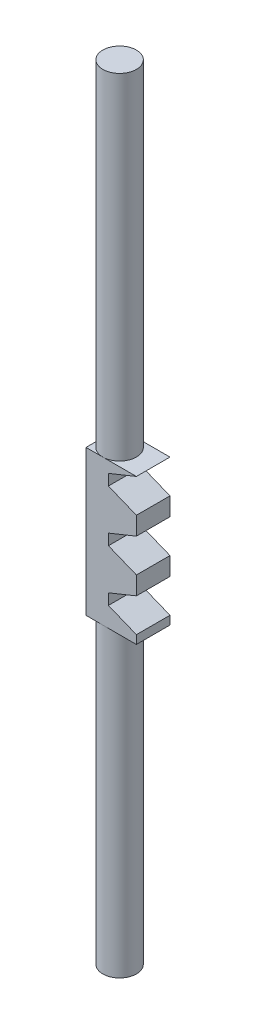
ISO-10303-21;
HEADER;
FILE_DESCRIPTION(('STEP AP214'),'2;1');
FILE_NAME('part.step','',(''),(''),'','','');
FILE_SCHEMA(('AUTOMOTIVE_DESIGN { 1 0 10303 214 1 1 1 1 }'));
ENDSEC;
DATA;
#1=APPLICATION_CONTEXT('core data for automotive mechanical design processes');
#2=APPLICATION_PROTOCOL_DEFINITION('international standard','automotive_design',2000,#1);
#3=PRODUCT_CONTEXT('',#1,'mechanical');
#4=PRODUCT('Part','Part','',(#3));
#5=PRODUCT_RELATED_PRODUCT_CATEGORY('part','',(#4));
#6=PRODUCT_DEFINITION_FORMATION('','',#4);
#7=PRODUCT_DEFINITION_CONTEXT('part definition',#1,'design');
#8=PRODUCT_DEFINITION('design','',#6,#7);
#9=PRODUCT_DEFINITION_SHAPE('','',#8);
#10=(LENGTH_UNIT() NAMED_UNIT(*) SI_UNIT(.MILLI.,.METRE.));
#11=(NAMED_UNIT(*) PLANE_ANGLE_UNIT() SI_UNIT($,.RADIAN.));
#12=(NAMED_UNIT(*) SI_UNIT($,.STERADIAN.) SOLID_ANGLE_UNIT());
#13=UNCERTAINTY_MEASURE_WITH_UNIT(LENGTH_MEASURE(1.E-05),#10,'distance_accuracy_value','');
#14=(GEOMETRIC_REPRESENTATION_CONTEXT(3) GLOBAL_UNCERTAINTY_ASSIGNED_CONTEXT((#13)) GLOBAL_UNIT_ASSIGNED_CONTEXT((#10,
#11,#12)) REPRESENTATION_CONTEXT('',''));
#15=CARTESIAN_POINT('',(0.,0.,0.));
#16=DIRECTION('',(0.,0.,1.));
#17=DIRECTION('',(1.,0.,0.));
#18=AXIS2_PLACEMENT_3D('',#15,#16,#17);
#19=CARTESIAN_POINT('',(0.,40.,0.));
#20=DIRECTION('',(0.,1.,0.));
#21=DIRECTION('',(0.,0.,1.));
#22=AXIS2_PLACEMENT_3D('',#19,#20,#21);
#23=PLANE('',#22);
#24=CARTESIAN_POINT('',(0.,40.,0.));
#25=DIRECTION('',(0.,1.,0.));
#26=DIRECTION('',(0.,0.,1.));
#27=AXIS2_PLACEMENT_3D('',#24,#25,#26);
#28=CIRCLE('',#27,1.5);
#29=CARTESIAN_POINT('',(0.,40.,1.5));
#30=VERTEX_POINT('',#29);
#31=CARTESIAN_POINT('',(0.,40.,-1.5));
#32=VERTEX_POINT('',#31);
#33=EDGE_CURVE('E53',#30,#32,#28,.T.);
#34=ORIENTED_EDGE('',*,*,#33,.F.);
#35=DIRECTION('',(1.,0.,0.));
#36=VECTOR('',#35,1.);
#37=CARTESIAN_POINT('',(0.,40.,1.5));
#38=LINE('',#37,#36);
#39=CARTESIAN_POINT('',(3.,40.,1.5));
#40=VERTEX_POINT('',#39);
#41=EDGE_CURVE('E176',#30,#40,#38,.T.);
#42=ORIENTED_EDGE('',*,*,#41,.T.);
#43=DIRECTION('',(0.,0.,1.));
#44=VECTOR('',#43,1.);
#45=CARTESIAN_POINT('',(3.,40.,-1.5));
#46=LINE('',#45,#44);
#47=CARTESIAN_POINT('',(3.,40.,-1.5));
#48=VERTEX_POINT('',#47);
#49=EDGE_CURVE('E323',#48,#40,#46,.T.);
#50=ORIENTED_EDGE('',*,*,#49,.F.);
#51=DIRECTION('',(1.,0.,0.));
#52=VECTOR('',#51,1.);
#53=CARTESIAN_POINT('',(0.,40.,-1.5));
#54=LINE('',#53,#52);
#55=EDGE_CURVE('E190',#32,#48,#54,.T.);
#56=ORIENTED_EDGE('',*,*,#55,.F.);
#57=EDGE_LOOP('',(#34,#42,#50,#56));
#58=FACE_BOUND('',#57,.T.);
#59=ADVANCED_FACE('F41',(#58),#23,.T.);
#60=CARTESIAN_POINT('',(-1.5,40.,0.));
#61=VERTEX_POINT('',#60);
#62=EDGE_CURVE('E11',#32,#61,#28,.T.);
#63=ORIENTED_EDGE('',*,*,#62,.F.);
#64=CARTESIAN_POINT('',(-1.5,40.,-1.5));
#65=VERTEX_POINT('',#64);
#66=EDGE_CURVE('E315',#65,#32,#54,.T.);
#67=ORIENTED_EDGE('',*,*,#66,.F.);
#68=DIRECTION('',(0.,0.,1.));
#69=VECTOR('',#68,1.);
#70=CARTESIAN_POINT('',(-1.5,40.,-1.5));
#71=LINE('',#70,#69);
#72=EDGE_CURVE('E319',#65,#61,#71,.T.);
#73=ORIENTED_EDGE('',*,*,#72,.T.);
#74=EDGE_LOOP('',(#63,#67,#73));
#75=FACE_BOUND('',#74,.T.);
#76=ADVANCED_FACE('F398',(#75),#23,.T.);
#77=CARTESIAN_POINT('',(3.,0.,-1.5));
#78=DIRECTION('',(-1.,0.,0.));
#79=DIRECTION('',(0.,-1.,0.));
#80=AXIS2_PLACEMENT_3D('',#77,#78,#79);
#81=PLANE('',#80);
#82=DIRECTION('',(0.,-1.,0.));
#83=VECTOR('',#82,1.);
#84=CARTESIAN_POINT('',(3.,0.,-1.5));
#85=LINE('',#84,#83);
#86=CARTESIAN_POINT('',(3.,37.,-1.5));
#87=VERTEX_POINT('',#86);
#88=CARTESIAN_POINT('',(3.,35.38,-1.5));
#89=VERTEX_POINT('',#88);
#90=EDGE_CURVE('E314',#87,#89,#85,.T.);
#91=ORIENTED_EDGE('',*,*,#90,.F.);
#92=DIRECTION('',(0.,0.,1.));
#93=VECTOR('',#92,1.);
#94=CARTESIAN_POINT('',(3.,37.,-2.5));
#95=LINE('',#94,#93);
#96=CARTESIAN_POINT('',(3.,37.,1.5));
#97=VERTEX_POINT('',#96);
#98=EDGE_CURVE('E213',#87,#97,#95,.T.);
#99=ORIENTED_EDGE('',*,*,#98,.T.);
#100=DIRECTION('',(0.,-1.,0.));
#101=VECTOR('',#100,1.);
#102=CARTESIAN_POINT('',(3.,0.,1.5));
#103=LINE('',#102,#101);
#104=CARTESIAN_POINT('',(3.,35.38,1.5));
#105=VERTEX_POINT('',#104);
#106=EDGE_CURVE('E188',#97,#105,#103,.T.);
#107=ORIENTED_EDGE('',*,*,#106,.T.);
#108=DIRECTION('',(0.,0.,-1.));
#109=VECTOR('',#108,1.);
#110=CARTESIAN_POINT('',(3.,35.38,-1.5));
#111=LINE('',#110,#109);
#112=EDGE_CURVE('E45',#105,#89,#111,.T.);
#113=ORIENTED_EDGE('',*,*,#112,.T.);
#114=EDGE_LOOP('',(#91,#99,#107,#113));
#115=FACE_BOUND('',#114,.T.);
#116=ADVANCED_FACE('F369',(#115),#81,.F.);
#117=CARTESIAN_POINT('',(3.,32.38,-1.5));
#118=VERTEX_POINT('',#117);
#119=CARTESIAN_POINT('',(3.,30.76,-1.5));
#120=VERTEX_POINT('',#119);
#121=EDGE_CURVE('E313',#118,#120,#85,.T.);
#122=ORIENTED_EDGE('',*,*,#121,.F.);
#123=DIRECTION('',(0.,0.,1.));
#124=VECTOR('',#123,1.);
#125=CARTESIAN_POINT('',(3.,32.38,-1.5));
#126=LINE('',#125,#124);
#127=CARTESIAN_POINT('',(3.,32.38,1.5));
#128=VERTEX_POINT('',#127);
#129=EDGE_CURVE('E199',#118,#128,#126,.T.);
#130=ORIENTED_EDGE('',*,*,#129,.T.);
#131=CARTESIAN_POINT('',(3.,30.76,1.5));
#132=VERTEX_POINT('',#131);
#133=EDGE_CURVE('E301',#128,#132,#103,.T.);
#134=ORIENTED_EDGE('',*,*,#133,.T.);
#135=DIRECTION('',(0.,0.,-1.));
#136=VECTOR('',#135,1.);
#137=CARTESIAN_POINT('',(3.,30.76,-1.5));
#138=LINE('',#137,#136);
#139=EDGE_CURVE('E347',#132,#120,#138,.T.);
#140=ORIENTED_EDGE('',*,*,#139,.T.);
#141=EDGE_LOOP('',(#122,#130,#134,#140));
#142=FACE_BOUND('',#141,.T.);
#143=ADVANCED_FACE('F356',(#142),#81,.F.);
#144=CARTESIAN_POINT('',(0.,40.,0.));
#145=DIRECTION('',(0.,-1.,0.));
#146=DIRECTION('',(0.,0.,-1.));
#147=AXIS2_PLACEMENT_3D('',#144,#145,#146);
#148=CYLINDRICAL_SURFACE('',#147,1.5);
#149=CARTESIAN_POINT('',(0.,0.,0.));
#150=DIRECTION('',(0.,1.,0.));
#151=DIRECTION('',(0.,0.,1.));
#152=AXIS2_PLACEMENT_3D('',#149,#150,#151);
#153=CIRCLE('',#152,1.5);
#154=CARTESIAN_POINT('',(0.,0.,1.5));
#155=VERTEX_POINT('',#154);
#156=EDGE_CURVE('E322',#155,#155,#153,.T.);
#157=ORIENTED_EDGE('',*,*,#156,.T.);
#158=EDGE_LOOP('',(#157));
#159=FACE_BOUND('',#158,.T.);
#160=CARTESIAN_POINT('',(0.,27.,0.));
#161=DIRECTION('',(0.,-1.,0.));
#162=DIRECTION('',(0.,0.,-1.));
#163=AXIS2_PLACEMENT_3D('',#160,#161,#162);
#164=CIRCLE('',#163,1.5);
#165=CARTESIAN_POINT('',(-1.5,27.,0.));
#166=VERTEX_POINT('',#165);
#167=CARTESIAN_POINT('',(0.,27.,-1.5));
#168=VERTEX_POINT('',#167);
#169=EDGE_CURVE('E341',#166,#168,#164,.T.);
#170=ORIENTED_EDGE('',*,*,#169,.T.);
#171=CARTESIAN_POINT('',(0.,27.,1.5));
#172=VERTEX_POINT('',#171);
#173=EDGE_CURVE('E342',#168,#172,#164,.T.);
#174=ORIENTED_EDGE('',*,*,#173,.T.);
#175=EDGE_CURVE('E337',#172,#166,#164,.T.);
#176=ORIENTED_EDGE('',*,*,#175,.T.);
#177=EDGE_LOOP('',(#170,#174,#176));
#178=FACE_BOUND('',#177,.T.);
#179=ADVANCED_FACE('F43',(#159,#178),#148,.T.);
#180=CARTESIAN_POINT('',(0.,0.,0.));
#181=DIRECTION('',(0.,1.,0.));
#182=DIRECTION('',(0.,0.,1.));
#183=AXIS2_PLACEMENT_3D('',#180,#181,#182);
#184=PLANE('',#183);
#185=ORIENTED_EDGE('',*,*,#156,.F.);
#186=EDGE_LOOP('',(#185));
#187=FACE_BOUND('',#186,.T.);
#188=ADVANCED_FACE('F425',(#187),#184,.F.);
#189=CARTESIAN_POINT('',(0.,27.,-1.5));
#190=DIRECTION('',(0.,-1.,0.));
#191=DIRECTION('',(0.,0.,-1.));
#192=AXIS2_PLACEMENT_3D('',#189,#190,#191);
#193=PLANE('',#192);
#194=ORIENTED_EDGE('',*,*,#173,.F.);
#195=DIRECTION('',(1.,0.,0.));
#196=VECTOR('',#195,1.);
#197=CARTESIAN_POINT('',(0.,27.,-1.5));
#198=LINE('',#197,#196);
#199=CARTESIAN_POINT('',(3.,27.,-1.5));
#200=VERTEX_POINT('',#199);
#201=EDGE_CURVE('E306',#168,#200,#198,.T.);
#202=ORIENTED_EDGE('',*,*,#201,.T.);
#203=DIRECTION('',(0.,0.,1.));
#204=VECTOR('',#203,1.);
#205=CARTESIAN_POINT('',(3.,27.,-1.5));
#206=LINE('',#205,#204);
#207=CARTESIAN_POINT('',(3.,27.,1.5));
#208=VERTEX_POINT('',#207);
#209=EDGE_CURVE('E326',#200,#208,#206,.T.);
#210=ORIENTED_EDGE('',*,*,#209,.T.);
#211=DIRECTION('',(1.,0.,0.));
#212=VECTOR('',#211,1.);
#213=CARTESIAN_POINT('',(0.,27.,1.5));
#214=LINE('',#213,#212);
#215=EDGE_CURVE('E294',#172,#208,#214,.T.);
#216=ORIENTED_EDGE('',*,*,#215,.F.);
#217=EDGE_LOOP('',(#194,#202,#210,#216));
#218=FACE_BOUND('',#217,.T.);
#219=ADVANCED_FACE('F417',(#218),#193,.T.);
#220=ORIENTED_EDGE('',*,*,#175,.F.);
#221=CARTESIAN_POINT('',(-1.5,27.,1.5));
#222=VERTEX_POINT('',#221);
#223=EDGE_CURVE('E295',#222,#172,#214,.T.);
#224=ORIENTED_EDGE('',*,*,#223,.F.);
#225=DIRECTION('',(0.,0.,1.));
#226=VECTOR('',#225,1.);
#227=CARTESIAN_POINT('',(-1.5,27.,-1.5));
#228=LINE('',#227,#226);
#229=EDGE_CURVE('E318',#166,#222,#228,.T.);
#230=ORIENTED_EDGE('',*,*,#229,.F.);
#231=EDGE_LOOP('',(#220,#224,#230));
#232=FACE_BOUND('',#231,.T.);
#233=ADVANCED_FACE('F418',(#232),#193,.T.);
#234=CARTESIAN_POINT('',(-1.5,0.,-1.5));
#235=DIRECTION('',(-1.,0.,0.));
#236=DIRECTION('',(0.,-1.,0.));
#237=AXIS2_PLACEMENT_3D('',#234,#235,#236);
#238=PLANE('',#237);
#239=CARTESIAN_POINT('',(-1.5,27.,-1.5));
#240=VERTEX_POINT('',#239);
#241=EDGE_CURVE('E330',#240,#166,#228,.T.);
#242=ORIENTED_EDGE('',*,*,#241,.T.);
#243=ORIENTED_EDGE('',*,*,#229,.T.);
#244=DIRECTION('',(0.,-1.,0.));
#245=VECTOR('',#244,1.);
#246=CARTESIAN_POINT('',(-1.5,0.,1.5));
#247=LINE('',#246,#245);
#248=CARTESIAN_POINT('',(-1.5,40.,1.5));
#249=VERTEX_POINT('',#248);
#250=EDGE_CURVE('E291',#249,#222,#247,.T.);
#251=ORIENTED_EDGE('',*,*,#250,.F.);
#252=EDGE_CURVE('E170',#61,#249,#71,.T.);
#253=ORIENTED_EDGE('',*,*,#252,.F.);
#254=ORIENTED_EDGE('',*,*,#72,.F.);
#255=DIRECTION('',(0.,-1.,0.));
#256=VECTOR('',#255,1.);
#257=CARTESIAN_POINT('',(-1.5,0.,-1.5));
#258=LINE('',#257,#256);
#259=EDGE_CURVE('E175',#65,#240,#258,.T.);
#260=ORIENTED_EDGE('',*,*,#259,.T.);
#261=EDGE_LOOP('',(#242,#243,#251,#253,#254,#260));
#262=FACE_BOUND('',#261,.T.);
#263=ADVANCED_FACE('F428',(#262),#238,.T.);
#264=CARTESIAN_POINT('',(0.,0.,-1.5));
#265=DIRECTION('',(0.,0.,1.));
#266=DIRECTION('',(1.,0.,0.));
#267=AXIS2_PLACEMENT_3D('',#264,#265,#266);
#268=PLANE('',#267);
#269=ORIENTED_EDGE('',*,*,#66,.T.);
#270=ORIENTED_EDGE('',*,*,#55,.T.);
#271=DIRECTION('',(-0.927183854566789,-0.374606593415909,0.));
#272=VECTOR('',#271,1.);
#273=CARTESIAN_POINT('',(-13.4721771096878,33.3448084510846,-1.5));
#274=LINE('',#273,#272);
#275=CARTESIAN_POINT('',(0.5,38.9899344354121,-1.5));
#276=VERTEX_POINT('',#275);
#277=EDGE_CURVE('E217',#48,#276,#274,.T.);
#278=ORIENTED_EDGE('',*,*,#277,.T.);
#279=DIRECTION('',(0.,-1.,0.));
#280=VECTOR('',#279,1.);
#281=CARTESIAN_POINT('',(0.5,0.,-1.5));
#282=LINE('',#281,#280);
#283=CARTESIAN_POINT('',(0.5,38.0100655645879,-1.5));
#284=VERTEX_POINT('',#283);
#285=EDGE_CURVE('E287',#276,#284,#282,.T.);
#286=ORIENTED_EDGE('',*,*,#285,.T.);
#287=DIRECTION('',(0.927183854566784,-0.374606593415919,0.));
#288=VECTOR('',#287,1.);
#289=CARTESIAN_POINT('',(13.2721701529837,32.8497738619534,-1.5));
#290=LINE('',#289,#288);
#291=EDGE_CURVE('E275',#284,#87,#290,.T.);
#292=ORIENTED_EDGE('',*,*,#291,.T.);
#293=ORIENTED_EDGE('',*,*,#90,.T.);
#294=DIRECTION('',(-0.927183854566789,-0.374606593415909,0.));
#295=VECTOR('',#294,1.);
#296=CARTESIAN_POINT('',(-11.8675162739276,29.3731335123024,-1.5));
#297=LINE('',#296,#295);
#298=CARTESIAN_POINT('',(0.5,34.3699344354121,-1.5));
#299=VERTEX_POINT('',#298);
#300=EDGE_CURVE('E271',#89,#299,#297,.T.);
#301=ORIENTED_EDGE('',*,*,#300,.T.);
#302=DIRECTION('',(0.,-1.,0.));
#303=VECTOR('',#302,1.);
#304=CARTESIAN_POINT('',(0.5,0.,-1.5));
#305=LINE('',#304,#303);
#306=CARTESIAN_POINT('',(0.5,33.3900655645879,-1.5));
#307=VERTEX_POINT('',#306);
#308=EDGE_CURVE('E283',#299,#307,#305,.T.);
#309=ORIENTED_EDGE('',*,*,#308,.T.);
#310=DIRECTION('',(0.927183854566784,-0.374606593415919,0.));
#311=VECTOR('',#310,1.);
#312=CARTESIAN_POINT('',(11.6675093172234,28.8780989231711,-1.5));
#313=LINE('',#312,#311);
#314=EDGE_CURVE('E267',#307,#118,#313,.T.);
#315=ORIENTED_EDGE('',*,*,#314,.T.);
#316=ORIENTED_EDGE('',*,*,#121,.T.);
#317=DIRECTION('',(-0.927183854566789,-0.374606593415908,0.));
#318=VECTOR('',#317,1.);
#319=CARTESIAN_POINT('',(-10.2628554381673,25.4014585735201,-1.5));
#320=LINE('',#319,#318);
#321=CARTESIAN_POINT('',(0.500000000000001,29.7499344354121,-1.5));
#322=VERTEX_POINT('',#321);
#323=EDGE_CURVE('E263',#120,#322,#320,.T.);
#324=ORIENTED_EDGE('',*,*,#323,.T.);
#325=DIRECTION('',(0.,-1.,0.));
#326=VECTOR('',#325,1.);
#327=CARTESIAN_POINT('',(0.500000000000001,0.,-1.5));
#328=LINE('',#327,#326);
#329=CARTESIAN_POINT('',(0.500000000000001,28.7700655645879,-1.5));
#330=VERTEX_POINT('',#329);
#331=EDGE_CURVE('E279',#322,#330,#328,.T.);
#332=ORIENTED_EDGE('',*,*,#331,.T.);
#333=DIRECTION('',(0.927183854566784,-0.374606593415919,0.));
#334=VECTOR('',#333,1.);
#335=CARTESIAN_POINT('',(10.0628484814631,24.9064239843888,-1.5));
#336=LINE('',#335,#334);
#337=CARTESIAN_POINT('',(3.,27.76,-1.5));
#338=VERTEX_POINT('',#337);
#339=EDGE_CURVE('E259',#330,#338,#336,.T.);
#340=ORIENTED_EDGE('',*,*,#339,.T.);
#341=EDGE_CURVE('E310',#338,#200,#85,.T.);
#342=ORIENTED_EDGE('',*,*,#341,.T.);
#343=ORIENTED_EDGE('',*,*,#201,.F.);
#344=EDGE_CURVE('E307',#240,#168,#198,.T.);
#345=ORIENTED_EDGE('',*,*,#344,.F.);
#346=ORIENTED_EDGE('',*,*,#259,.F.);
#347=EDGE_LOOP('',(#269,#270,#278,#286,#292,#293,#301,#309,#315,#316,#324,#332,#340,#342,#343,
#345,#346));
#348=FACE_BOUND('',#347,.T.);
#349=ADVANCED_FACE('F377',(#348),#268,.F.);
#350=CARTESIAN_POINT('',(0.,0.,1.5));
#351=DIRECTION('',(0.,0.,1.));
#352=DIRECTION('',(1.,0.,0.));
#353=AXIS2_PLACEMENT_3D('',#350,#351,#352);
#354=PLANE('',#353);
#355=DIRECTION('',(-0.927183854566789,-0.374606593415908,0.));
#356=VECTOR('',#355,1.);
#357=CARTESIAN_POINT('',(3.,40.,1.5));
#358=LINE('',#357,#356);
#359=CARTESIAN_POINT('',(0.5,38.9899344354121,1.5));
#360=VERTEX_POINT('',#359);
#361=EDGE_CURVE('E183',#40,#360,#358,.T.);
#362=ORIENTED_EDGE('',*,*,#361,.F.);
#363=ORIENTED_EDGE('',*,*,#41,.F.);
#364=EDGE_CURVE('E167',#249,#30,#38,.T.);
#365=ORIENTED_EDGE('',*,*,#364,.F.);
#366=ORIENTED_EDGE('',*,*,#250,.T.);
#367=ORIENTED_EDGE('',*,*,#223,.T.);
#368=ORIENTED_EDGE('',*,*,#215,.T.);
#369=CARTESIAN_POINT('',(3.,27.76,1.5));
#370=VERTEX_POINT('',#369);
#371=EDGE_CURVE('E299',#370,#208,#103,.T.);
#372=ORIENTED_EDGE('',*,*,#371,.F.);
#373=DIRECTION('',(0.927183854566784,-0.374606593415919,0.));
#374=VECTOR('',#373,1.);
#375=CARTESIAN_POINT('',(3.,27.76,1.5));
#376=LINE('',#375,#374);
#377=CARTESIAN_POINT('',(0.500000000000001,28.7700655645879,1.5));
#378=VERTEX_POINT('',#377);
#379=EDGE_CURVE('E248',#378,#370,#376,.T.);
#380=ORIENTED_EDGE('',*,*,#379,.F.);
#381=DIRECTION('',(0.,-1.,0.));
#382=VECTOR('',#381,1.);
#383=CARTESIAN_POINT('',(0.500000000000001,29.7499344354121,1.5));
#384=LINE('',#383,#382);
#385=CARTESIAN_POINT('',(0.500000000000001,29.7499344354121,1.5));
#386=VERTEX_POINT('',#385);
#387=EDGE_CURVE('E244',#386,#378,#384,.T.);
#388=ORIENTED_EDGE('',*,*,#387,.F.);
#389=DIRECTION('',(-0.927183854566789,-0.374606593415908,0.));
#390=VECTOR('',#389,1.);
#391=CARTESIAN_POINT('',(3.,30.76,1.5));
#392=LINE('',#391,#390);
#393=EDGE_CURVE('E240',#132,#386,#392,.T.);
#394=ORIENTED_EDGE('',*,*,#393,.F.);
#395=ORIENTED_EDGE('',*,*,#133,.F.);
#396=DIRECTION('',(0.927183854566784,-0.374606593415919,0.));
#397=VECTOR('',#396,1.);
#398=CARTESIAN_POINT('',(3.,32.38,1.5));
#399=LINE('',#398,#397);
#400=CARTESIAN_POINT('',(0.5,33.3900655645879,1.5));
#401=VERTEX_POINT('',#400);
#402=EDGE_CURVE('E232',#401,#128,#399,.T.);
#403=ORIENTED_EDGE('',*,*,#402,.F.);
#404=DIRECTION('',(0.,-1.,0.));
#405=VECTOR('',#404,1.);
#406=CARTESIAN_POINT('',(0.5,34.3699344354121,1.5));
#407=LINE('',#406,#405);
#408=CARTESIAN_POINT('',(0.5,34.3699344354121,1.5));
#409=VERTEX_POINT('',#408);
#410=EDGE_CURVE('E227',#409,#401,#407,.T.);
#411=ORIENTED_EDGE('',*,*,#410,.F.);
#412=DIRECTION('',(-0.927183854566789,-0.374606593415908,0.));
#413=VECTOR('',#412,1.);
#414=CARTESIAN_POINT('',(3.,35.38,1.5));
#415=LINE('',#414,#413);
#416=EDGE_CURVE('E223',#105,#409,#415,.T.);
#417=ORIENTED_EDGE('',*,*,#416,.F.);
#418=ORIENTED_EDGE('',*,*,#106,.F.);
#419=DIRECTION('',(0.927183854566784,-0.374606593415919,0.));
#420=VECTOR('',#419,1.);
#421=CARTESIAN_POINT('',(3.,37.,1.5));
#422=LINE('',#421,#420);
#423=CARTESIAN_POINT('',(0.5,38.0100655645879,1.5));
#424=VERTEX_POINT('',#423);
#425=EDGE_CURVE('E209',#424,#97,#422,.T.);
#426=ORIENTED_EDGE('',*,*,#425,.F.);
#427=DIRECTION('',(0.,-1.,0.));
#428=VECTOR('',#427,1.);
#429=CARTESIAN_POINT('',(0.5,38.9899344354121,1.5));
#430=LINE('',#429,#428);
#431=EDGE_CURVE('E204',#360,#424,#430,.T.);
#432=ORIENTED_EDGE('',*,*,#431,.F.);
#433=EDGE_LOOP('',(#362,#363,#365,#366,#367,#368,#372,#380,#388,#394,#395,#403,#411,#417,#418,
#426,#432));
#434=FACE_BOUND('',#433,.T.);
#435=ADVANCED_FACE('F180',(#434),#354,.T.);
#436=ORIENTED_EDGE('',*,*,#341,.F.);
#437=DIRECTION('',(0.,0.,1.));
#438=VECTOR('',#437,1.);
#439=CARTESIAN_POINT('',(3.,27.76,-1.5));
#440=LINE('',#439,#438);
#441=EDGE_CURVE('E343',#338,#370,#440,.T.);
#442=ORIENTED_EDGE('',*,*,#441,.T.);
#443=ORIENTED_EDGE('',*,*,#371,.T.);
#444=ORIENTED_EDGE('',*,*,#209,.F.);
#445=EDGE_LOOP('',(#436,#442,#443,#444));
#446=FACE_BOUND('',#445,.T.);
#447=ADVANCED_FACE('F414',(#446),#81,.F.);
#448=ORIENTED_EDGE('',*,*,#169,.F.);
#449=ORIENTED_EDGE('',*,*,#241,.F.);
#450=ORIENTED_EDGE('',*,*,#344,.T.);
#451=EDGE_LOOP('',(#448,#449,#450));
#452=FACE_BOUND('',#451,.T.);
#453=ADVANCED_FACE('F406',(#452),#193,.T.);
#454=EDGE_CURVE('E51',#61,#30,#28,.T.);
#455=ORIENTED_EDGE('',*,*,#454,.F.);
#456=ORIENTED_EDGE('',*,*,#252,.T.);
#457=ORIENTED_EDGE('',*,*,#364,.T.);
#458=EDGE_LOOP('',(#455,#456,#457));
#459=FACE_BOUND('',#458,.T.);
#460=ADVANCED_FACE('F169',(#459),#23,.T.);
#461=CARTESIAN_POINT('',(0.5,38.9899344354121,-2.5));
#462=DIRECTION('',(-1.,0.,0.));
#463=DIRECTION('',(0.,0.,1.));
#464=AXIS2_PLACEMENT_3D('',#461,#462,#463);
#465=PLANE('',#464);
#466=DIRECTION('',(0.,0.,1.));
#467=VECTOR('',#466,1.);
#468=CARTESIAN_POINT('',(0.5,38.9899344354121,-2.5));
#469=LINE('',#468,#467);
#470=EDGE_CURVE('E212',#276,#360,#469,.T.);
#471=ORIENTED_EDGE('',*,*,#470,.T.);
#472=ORIENTED_EDGE('',*,*,#431,.T.);
#473=DIRECTION('',(0.,0.,1.));
#474=VECTOR('',#473,1.);
#475=CARTESIAN_POINT('',(0.5,38.0100655645879,-2.5));
#476=LINE('',#475,#474);
#477=EDGE_CURVE('E218',#284,#424,#476,.T.);
#478=ORIENTED_EDGE('',*,*,#477,.F.);
#479=ORIENTED_EDGE('',*,*,#285,.F.);
#480=EDGE_LOOP('',(#471,#472,#478,#479));
#481=FACE_BOUND('',#480,.T.);
#482=ADVANCED_FACE('F405',(#481),#465,.F.);
#483=CARTESIAN_POINT('',(3.,37.,-2.5));
#484=DIRECTION('',(-0.374606593415919,-0.927183854566784,0.));
#485=DIRECTION('',(0.927183854566784,-0.374606593415919,0.));
#486=AXIS2_PLACEMENT_3D('',#483,#484,#485);
#487=PLANE('',#486);
#488=ORIENTED_EDGE('',*,*,#477,.T.);
#489=ORIENTED_EDGE('',*,*,#425,.T.);
#490=ORIENTED_EDGE('',*,*,#98,.F.);
#491=ORIENTED_EDGE('',*,*,#291,.F.);
#492=EDGE_LOOP('',(#488,#489,#490,#491));
#493=FACE_BOUND('',#492,.T.);
#494=ADVANCED_FACE('F411',(#493),#487,.F.);
#495=CARTESIAN_POINT('',(3.,40.,-2.5));
#496=DIRECTION('',(-0.374606593415908,0.927183854566789,0.));
#497=DIRECTION('',(-0.927183854566789,-0.374606593415909,0.));
#498=AXIS2_PLACEMENT_3D('',#495,#496,#497);
#499=PLANE('',#498);
#500=ORIENTED_EDGE('',*,*,#49,.T.);
#501=ORIENTED_EDGE('',*,*,#361,.T.);
#502=ORIENTED_EDGE('',*,*,#470,.F.);
#503=ORIENTED_EDGE('',*,*,#277,.F.);
#504=EDGE_LOOP('',(#500,#501,#502,#503));
#505=FACE_BOUND('',#504,.T.);
#506=ADVANCED_FACE('F466',(#505),#499,.F.);
#507=CARTESIAN_POINT('',(0.500000000000001,29.7499344354121,-2.5));
#508=DIRECTION('',(-1.,0.,0.));
#509=DIRECTION('',(0.,0.,1.));
#510=AXIS2_PLACEMENT_3D('',#507,#508,#509);
#511=PLANE('',#510);
#512=DIRECTION('',(0.,0.,1.));
#513=VECTOR('',#512,1.);
#514=CARTESIAN_POINT('',(0.500000000000001,29.7499344354121,-2.5));
#515=LINE('',#514,#513);
#516=EDGE_CURVE('E251',#322,#386,#515,.T.);
#517=ORIENTED_EDGE('',*,*,#516,.T.);
#518=ORIENTED_EDGE('',*,*,#387,.T.);
#519=DIRECTION('',(0.,0.,1.));
#520=VECTOR('',#519,1.);
#521=CARTESIAN_POINT('',(0.500000000000001,28.7700655645879,-2.5));
#522=LINE('',#521,#520);
#523=EDGE_CURVE('E228',#330,#378,#522,.T.);
#524=ORIENTED_EDGE('',*,*,#523,.F.);
#525=ORIENTED_EDGE('',*,*,#331,.F.);
#526=EDGE_LOOP('',(#517,#518,#524,#525));
#527=FACE_BOUND('',#526,.T.);
#528=ADVANCED_FACE('F458',(#527),#511,.F.);
#529=CARTESIAN_POINT('',(3.,30.76,-2.5));
#530=DIRECTION('',(-0.374606593415909,0.927183854566789,0.));
#531=DIRECTION('',(-0.927183854566789,-0.374606593415908,0.));
#532=AXIS2_PLACEMENT_3D('',#529,#530,#531);
#533=PLANE('',#532);
#534=ORIENTED_EDGE('',*,*,#139,.F.);
#535=ORIENTED_EDGE('',*,*,#393,.T.);
#536=ORIENTED_EDGE('',*,*,#516,.F.);
#537=ORIENTED_EDGE('',*,*,#323,.F.);
#538=EDGE_LOOP('',(#534,#535,#536,#537));
#539=FACE_BOUND('',#538,.T.);
#540=ADVANCED_FACE('F393',(#539),#533,.F.);
#541=CARTESIAN_POINT('',(3.,27.76,-2.5));
#542=DIRECTION('',(-0.374606593415919,-0.927183854566784,0.));
#543=DIRECTION('',(0.927183854566784,-0.374606593415919,0.));
#544=AXIS2_PLACEMENT_3D('',#541,#542,#543);
#545=PLANE('',#544);
#546=ORIENTED_EDGE('',*,*,#523,.T.);
#547=ORIENTED_EDGE('',*,*,#379,.T.);
#548=ORIENTED_EDGE('',*,*,#441,.F.);
#549=ORIENTED_EDGE('',*,*,#339,.F.);
#550=EDGE_LOOP('',(#546,#547,#548,#549));
#551=FACE_BOUND('',#550,.T.);
#552=ADVANCED_FACE('F386',(#551),#545,.F.);
#553=CARTESIAN_POINT('',(0.5,34.3699344354121,-2.5));
#554=DIRECTION('',(-1.,0.,0.));
#555=DIRECTION('',(0.,0.,1.));
#556=AXIS2_PLACEMENT_3D('',#553,#554,#555);
#557=PLANE('',#556);
#558=DIRECTION('',(0.,0.,1.));
#559=VECTOR('',#558,1.);
#560=CARTESIAN_POINT('',(0.5,34.3699344354121,-2.5));
#561=LINE('',#560,#559);
#562=EDGE_CURVE('E235',#299,#409,#561,.T.);
#563=ORIENTED_EDGE('',*,*,#562,.T.);
#564=ORIENTED_EDGE('',*,*,#410,.T.);
#565=DIRECTION('',(0.,0.,1.));
#566=VECTOR('',#565,1.);
#567=CARTESIAN_POINT('',(0.5,33.3900655645879,-2.5));
#568=LINE('',#567,#566);
#569=EDGE_CURVE('E205',#307,#401,#568,.T.);
#570=ORIENTED_EDGE('',*,*,#569,.F.);
#571=ORIENTED_EDGE('',*,*,#308,.F.);
#572=EDGE_LOOP('',(#563,#564,#570,#571));
#573=FACE_BOUND('',#572,.T.);
#574=ADVANCED_FACE('F384',(#573),#557,.F.);
#575=CARTESIAN_POINT('',(3.,35.38,-2.5));
#576=DIRECTION('',(-0.374606593415908,0.927183854566789,0.));
#577=DIRECTION('',(-0.927183854566789,-0.374606593415909,0.));
#578=AXIS2_PLACEMENT_3D('',#575,#576,#577);
#579=PLANE('',#578);
#580=ORIENTED_EDGE('',*,*,#112,.F.);
#581=ORIENTED_EDGE('',*,*,#416,.T.);
#582=ORIENTED_EDGE('',*,*,#562,.F.);
#583=ORIENTED_EDGE('',*,*,#300,.F.);
#584=EDGE_LOOP('',(#580,#581,#582,#583));
#585=FACE_BOUND('',#584,.T.);
#586=ADVANCED_FACE('F375',(#585),#579,.F.);
#587=CARTESIAN_POINT('',(3.,32.38,-2.5));
#588=DIRECTION('',(-0.374606593415919,-0.927183854566784,0.));
#589=DIRECTION('',(0.927183854566784,-0.374606593415919,0.));
#590=AXIS2_PLACEMENT_3D('',#587,#588,#589);
#591=PLANE('',#590);
#592=ORIENTED_EDGE('',*,*,#569,.T.);
#593=ORIENTED_EDGE('',*,*,#402,.T.);
#594=ORIENTED_EDGE('',*,*,#129,.F.);
#595=ORIENTED_EDGE('',*,*,#314,.F.);
#596=EDGE_LOOP('',(#592,#593,#594,#595));
#597=FACE_BOUND('',#596,.T.);
#598=ADVANCED_FACE('F382',(#597),#591,.F.);
#599=CARTESIAN_POINT('',(0.,70.,0.));
#600=DIRECTION('',(0.,-1.,0.));
#601=DIRECTION('',(0.,0.,-1.));
#602=AXIS2_PLACEMENT_3D('',#599,#600,#601);
#603=CYLINDRICAL_SURFACE('',#602,1.5);
#604=CARTESIAN_POINT('',(0.,70.,0.));
#605=DIRECTION('',(0.,1.,0.));
#606=DIRECTION('',(0.,0.,1.));
#607=AXIS2_PLACEMENT_3D('',#604,#605,#606);
#608=CIRCLE('',#607,1.5);
#609=CARTESIAN_POINT('',(0.,70.,1.5));
#610=VERTEX_POINT('',#609);
#611=EDGE_CURVE('E194',#610,#610,#608,.T.);
#612=ORIENTED_EDGE('',*,*,#611,.F.);
#613=EDGE_LOOP('',(#612));
#614=FACE_BOUND('',#613,.T.);
#615=ORIENTED_EDGE('',*,*,#33,.T.);
#616=ORIENTED_EDGE('',*,*,#62,.T.);
#617=ORIENTED_EDGE('',*,*,#454,.T.);
#618=EDGE_LOOP('',(#615,#616,#617));
#619=FACE_BOUND('',#618,.T.);
#620=ADVANCED_FACE('F195',(#614,#619),#603,.T.);
#621=CARTESIAN_POINT('',(0.,70.,0.));
#622=DIRECTION('',(0.,1.,0.));
#623=DIRECTION('',(0.,0.,1.));
#624=AXIS2_PLACEMENT_3D('',#621,#622,#623);
#625=PLANE('',#624);
#626=ORIENTED_EDGE('',*,*,#611,.T.);
#627=EDGE_LOOP('',(#626));
#628=FACE_BOUND('',#627,.T.);
#629=ADVANCED_FACE('F635',(#628),#625,.T.);
#630=CLOSED_SHELL('',(#59,#76,#116,#143,#179,#188,#219,#233,#263,#349,#435,#447,#453,#460,#482,
#494,#506,#528,#540,#552,#574,#586,#598,#620,#629));
#631=MANIFOLD_SOLID_BREP('B2',#630);
#632=ADVANCED_BREP_SHAPE_REPRESENTATION('',(#18,#631),#14);
#633=SHAPE_DEFINITION_REPRESENTATION(#9,#632);
ENDSEC;
END-ISO-10303-21;
